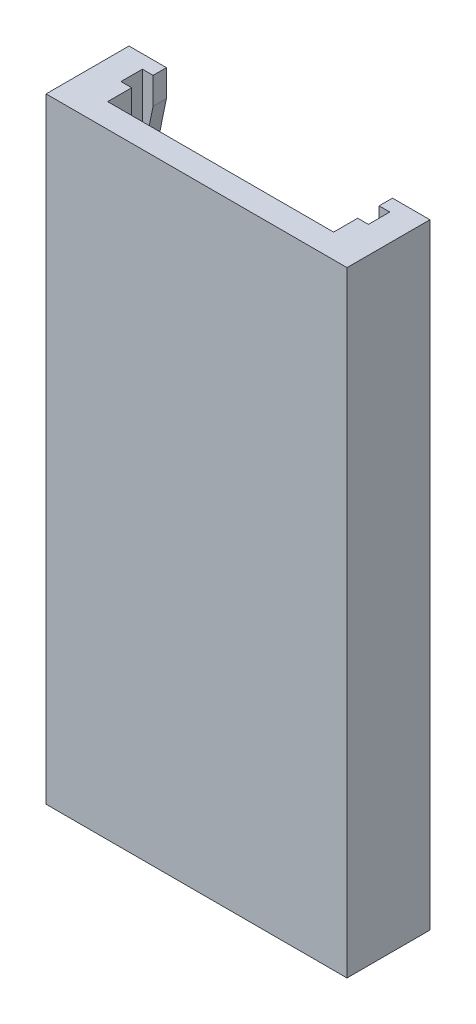
ISO-10303-21;
HEADER;
FILE_DESCRIPTION(('STEP AP214'),'2;1');
FILE_NAME('part.step','',(''),(''),'','','');
FILE_SCHEMA(('AUTOMOTIVE_DESIGN { 1 0 10303 214 1 1 1 1 }'));
ENDSEC;
DATA;
#1=APPLICATION_CONTEXT('core data for automotive mechanical design processes');
#2=APPLICATION_PROTOCOL_DEFINITION('international standard','automotive_design',2000,#1);
#3=PRODUCT_CONTEXT('',#1,'mechanical');
#4=PRODUCT('Part','Part','',(#3));
#5=PRODUCT_RELATED_PRODUCT_CATEGORY('part','',(#4));
#6=PRODUCT_DEFINITION_FORMATION('','',#4);
#7=PRODUCT_DEFINITION_CONTEXT('part definition',#1,'design');
#8=PRODUCT_DEFINITION('design','',#6,#7);
#9=PRODUCT_DEFINITION_SHAPE('','',#8);
#10=(LENGTH_UNIT() NAMED_UNIT(*) SI_UNIT(.MILLI.,.METRE.));
#11=(NAMED_UNIT(*) PLANE_ANGLE_UNIT() SI_UNIT($,.RADIAN.));
#12=(NAMED_UNIT(*) SI_UNIT($,.STERADIAN.) SOLID_ANGLE_UNIT());
#13=UNCERTAINTY_MEASURE_WITH_UNIT(LENGTH_MEASURE(1.E-05),#10,'distance_accuracy_value','');
#14=(GEOMETRIC_REPRESENTATION_CONTEXT(3) GLOBAL_UNCERTAINTY_ASSIGNED_CONTEXT((#13)) GLOBAL_UNIT_ASSIGNED_CONTEXT((#10,
#11,#12)) REPRESENTATION_CONTEXT('',''));
#15=CARTESIAN_POINT('',(0.,0.,0.));
#16=DIRECTION('',(0.,0.,1.));
#17=DIRECTION('',(1.,0.,0.));
#18=AXIS2_PLACEMENT_3D('',#15,#16,#17);
#19=CARTESIAN_POINT('',(0.,-28.9746696035242,0.));
#20=DIRECTION('',(0.,1.,0.));
#21=DIRECTION('',(0.,0.,1.));
#22=AXIS2_PLACEMENT_3D('',#19,#20,#21);
#23=PLANE('',#22);
#24=DIRECTION('',(-1.,0.,0.));
#25=VECTOR('',#24,1.);
#26=CARTESIAN_POINT('',(0.,-28.9746696035242,0.));
#27=LINE('',#26,#25);
#28=CARTESIAN_POINT('',(-0.3281938325991,-28.9746696035242,0.));
#29=VERTEX_POINT('',#28);
#30=CARTESIAN_POINT('',(-15.8281938325991,-28.9746696035242,0.));
#31=VERTEX_POINT('',#30);
#32=EDGE_CURVE('E208',#29,#31,#27,.T.);
#33=ORIENTED_EDGE('',*,*,#32,.T.);
#34=DIRECTION('',(0.,0.,-1.));
#35=VECTOR('',#34,1.);
#36=CARTESIAN_POINT('',(-15.8281938325991,-28.9746696035242,1.));
#37=LINE('',#36,#35);
#38=CARTESIAN_POINT('',(-15.8281938325991,-28.9746696035242,1.));
#39=VERTEX_POINT('',#38);
#40=EDGE_CURVE('E214',#39,#31,#37,.T.);
#41=ORIENTED_EDGE('',*,*,#40,.F.);
#42=DIRECTION('',(1.,0.,0.));
#43=VECTOR('',#42,1.);
#44=CARTESIAN_POINT('',(0.,-28.9746696035242,1.));
#45=LINE('',#44,#43);
#46=CARTESIAN_POINT('',(-17.3281938325991,-28.9746696035242,1.));
#47=VERTEX_POINT('',#46);
#48=EDGE_CURVE('E198',#47,#39,#45,.T.);
#49=ORIENTED_EDGE('',*,*,#48,.F.);
#50=DIRECTION('',(0.,0.,-1.));
#51=VECTOR('',#50,1.);
#52=CARTESIAN_POINT('',(-17.3281938325991,-28.9746696035242,0.));
#53=LINE('',#52,#51);
#54=CARTESIAN_POINT('',(-17.3281938325991,-28.9746696035242,2.6));
#55=VERTEX_POINT('',#54);
#56=EDGE_CURVE('E207',#55,#47,#53,.T.);
#57=ORIENTED_EDGE('',*,*,#56,.F.);
#58=DIRECTION('',(1.,0.,0.));
#59=VECTOR('',#58,1.);
#60=CARTESIAN_POINT('',(0.,-28.9746696035242,2.6));
#61=LINE('',#60,#59);
#62=CARTESIAN_POINT('',(-16.5281938325991,-28.9746696035242,2.6));
#63=VERTEX_POINT('',#62);
#64=EDGE_CURVE('E277',#55,#63,#61,.T.);
#65=ORIENTED_EDGE('',*,*,#64,.T.);
#66=DIRECTION('',(0.,0.,1.));
#67=VECTOR('',#66,1.);
#68=CARTESIAN_POINT('',(-16.5281938325991,-28.9746696035242,0.));
#69=LINE('',#68,#67);
#70=CARTESIAN_POINT('',(-16.5281938325991,-28.9746696035242,4.4));
#71=VERTEX_POINT('',#70);
#72=EDGE_CURVE('E281',#63,#71,#69,.T.);
#73=ORIENTED_EDGE('',*,*,#72,.T.);
#74=DIRECTION('',(1.,0.,0.));
#75=VECTOR('',#74,1.);
#76=CARTESIAN_POINT('',(0.,-28.9746696035242,4.4));
#77=LINE('',#76,#75);
#78=CARTESIAN_POINT('',(0.371806167400894,-28.9746696035242,4.4));
#79=VERTEX_POINT('',#78);
#80=EDGE_CURVE('E285',#71,#79,#77,.T.);
#81=ORIENTED_EDGE('',*,*,#80,.T.);
#82=DIRECTION('',(0.,0.,-1.));
#83=VECTOR('',#82,1.);
#84=CARTESIAN_POINT('',(0.371806167400894,-28.9746696035242,0.));
#85=LINE('',#84,#83);
#86=CARTESIAN_POINT('',(0.371806167400894,-28.9746696035242,2.6));
#87=VERTEX_POINT('',#86);
#88=EDGE_CURVE('E289',#79,#87,#85,.T.);
#89=ORIENTED_EDGE('',*,*,#88,.T.);
#90=DIRECTION('',(1.,0.,0.));
#91=VECTOR('',#90,1.);
#92=CARTESIAN_POINT('',(0.,-28.9746696035242,2.6));
#93=LINE('',#92,#91);
#94=CARTESIAN_POINT('',(1.17180616740089,-28.9746696035242,2.6));
#95=VERTEX_POINT('',#94);
#96=EDGE_CURVE('E293',#87,#95,#93,.T.);
#97=ORIENTED_EDGE('',*,*,#96,.T.);
#98=DIRECTION('',(0.,0.,-1.));
#99=VECTOR('',#98,1.);
#100=CARTESIAN_POINT('',(1.17180616740089,-28.9746696035242,0.));
#101=LINE('',#100,#99);
#102=CARTESIAN_POINT('',(1.17180616740089,-28.9746696035242,1.));
#103=VERTEX_POINT('',#102);
#104=EDGE_CURVE('E297',#95,#103,#101,.T.);
#105=ORIENTED_EDGE('',*,*,#104,.T.);
#106=DIRECTION('',(-1.,0.,0.));
#107=VECTOR('',#106,1.);
#108=CARTESIAN_POINT('',(0.,-28.9746696035242,1.));
#109=LINE('',#108,#107);
#110=CARTESIAN_POINT('',(-0.3281938325991,-28.9746696035242,1.));
#111=VERTEX_POINT('',#110);
#112=EDGE_CURVE('E61',#103,#111,#109,.T.);
#113=ORIENTED_EDGE('',*,*,#112,.T.);
#114=DIRECTION('',(0.,0.,-1.));
#115=VECTOR('',#114,1.);
#116=CARTESIAN_POINT('',(-0.3281938325991,-28.9746696035242,1.));
#117=LINE('',#116,#115);
#118=EDGE_CURVE('E223',#111,#29,#117,.T.);
#119=ORIENTED_EDGE('',*,*,#118,.T.);
#120=EDGE_LOOP('',(#33,#41,#49,#57,#65,#73,#81,#89,#97,#105,#113,#119));
#121=FACE_BOUND('',#120,.T.);
#122=ADVANCED_FACE('F45',(#121),#23,.T.);
#123=CARTESIAN_POINT('',(0.,-28.9746696035242,1.));
#124=DIRECTION('',(0.,0.,-1.));
#125=DIRECTION('',(-1.,0.,0.));
#126=AXIS2_PLACEMENT_3D('',#123,#124,#125);
#127=PLANE('',#126);
#128=DIRECTION('',(0.,1.,0.));
#129=VECTOR('',#128,1.);
#130=CARTESIAN_POINT('',(0.371806167400894,-28.9746696035242,1.));
#131=LINE('',#130,#129);
#132=CARTESIAN_POINT('',(0.371806167400894,12.0253303964758,1.));
#133=VERTEX_POINT('',#132);
#134=CARTESIAN_POINT('',(0.371806167400894,14.0253303964758,1.));
#135=VERTEX_POINT('',#134);
#136=EDGE_CURVE('E300',#133,#135,#131,.T.);
#137=ORIENTED_EDGE('',*,*,#136,.F.);
#138=DIRECTION('',(0.200944143721333,-0.97960270064149,0.));
#139=VECTOR('',#138,1.);
#140=CARTESIAN_POINT('',(8.42745563445858,-27.2459607554302,1.));
#141=LINE('',#140,#139);
#142=CARTESIAN_POINT('',(1.1718061674009,8.12533039647577,1.));
#143=VERTEX_POINT('',#142);
#144=EDGE_CURVE('E263',#133,#143,#141,.T.);
#145=ORIENTED_EDGE('',*,*,#144,.T.);
#146=DIRECTION('',(0.,1.,0.));
#147=VECTOR('',#146,1.);
#148=CARTESIAN_POINT('',(1.17180616740089,-28.9746696035242,1.));
#149=LINE('',#148,#147);
#150=CARTESIAN_POINT('',(1.17180616740089,14.0253303964758,1.));
#151=VERTEX_POINT('',#150);
#152=EDGE_CURVE('E348',#143,#151,#149,.T.);
#153=ORIENTED_EDGE('',*,*,#152,.T.);
#154=DIRECTION('',(-1.,0.,0.));
#155=VECTOR('',#154,1.);
#156=CARTESIAN_POINT('',(0.,14.0253303964758,1.));
#157=LINE('',#156,#155);
#158=EDGE_CURVE('E218',#151,#135,#157,.T.);
#159=ORIENTED_EDGE('',*,*,#158,.T.);
#160=EDGE_LOOP('',(#137,#145,#153,#159));
#161=FACE_BOUND('',#160,.T.);
#162=ADVANCED_FACE('F432',(#161),#127,.F.);
#163=CARTESIAN_POINT('',(0.,-28.9746696035242,1.));
#164=DIRECTION('',(0.,0.,1.));
#165=DIRECTION('',(1.,0.,0.));
#166=AXIS2_PLACEMENT_3D('',#163,#164,#165);
#167=PLANE('',#166);
#168=DIRECTION('',(0.,1.,0.));
#169=VECTOR('',#168,1.);
#170=CARTESIAN_POINT('',(-17.3281938325991,-28.9746696035242,1.));
#171=LINE('',#170,#169);
#172=CARTESIAN_POINT('',(-17.3281938325991,8.12533039647577,1.));
#173=VERTEX_POINT('',#172);
#174=CARTESIAN_POINT('',(-17.3281938325991,14.0253303964758,1.));
#175=VERTEX_POINT('',#174);
#176=EDGE_CURVE('E369',#173,#175,#171,.T.);
#177=ORIENTED_EDGE('',*,*,#176,.F.);
#178=DIRECTION('',(0.200944143721332,0.97960270064149,0.));
#179=VECTOR('',#178,1.);
#180=CARTESIAN_POINT('',(-23.9314718103364,-24.0656497449937,1.));
#181=LINE('',#180,#179);
#182=CARTESIAN_POINT('',(-16.5281938325991,12.0253303964758,1.));
#183=VERTEX_POINT('',#182);
#184=EDGE_CURVE('E219',#173,#183,#181,.T.);
#185=ORIENTED_EDGE('',*,*,#184,.T.);
#186=DIRECTION('',(0.,1.,0.));
#187=VECTOR('',#186,1.);
#188=CARTESIAN_POINT('',(-16.5281938325991,-28.9746696035242,1.));
#189=LINE('',#188,#187);
#190=CARTESIAN_POINT('',(-16.5281938325991,14.0253303964758,1.));
#191=VERTEX_POINT('',#190);
#192=EDGE_CURVE('E370',#183,#191,#189,.T.);
#193=ORIENTED_EDGE('',*,*,#192,.T.);
#194=DIRECTION('',(1.,0.,0.));
#195=VECTOR('',#194,1.);
#196=CARTESIAN_POINT('',(0.,14.0253303964758,1.));
#197=LINE('',#196,#195);
#198=EDGE_CURVE('E312',#175,#191,#197,.T.);
#199=ORIENTED_EDGE('',*,*,#198,.F.);
#200=EDGE_LOOP('',(#177,#185,#193,#199));
#201=FACE_BOUND('',#200,.T.);
#202=ADVANCED_FACE('F460',(#201),#167,.T.);
#203=CARTESIAN_POINT('',(-16.5281938325991,-28.9746696035242,0.));
#204=DIRECTION('',(1.,0.,0.));
#205=DIRECTION('',(0.,0.,-1.));
#206=AXIS2_PLACEMENT_3D('',#203,#204,#205);
#207=PLANE('',#206);
#208=ORIENTED_EDGE('',*,*,#192,.F.);
#209=DIRECTION('',(0.,0.,-1.));
#210=VECTOR('',#209,1.);
#211=CARTESIAN_POINT('',(-16.5281938325991,12.0253303964758,6.36112017807918E-13));
#212=LINE('',#211,#210);
#213=CARTESIAN_POINT('',(-16.5281938325991,12.0253303964758,0.));
#214=VERTEX_POINT('',#213);
#215=EDGE_CURVE('E11',#183,#214,#212,.T.);
#216=ORIENTED_EDGE('',*,*,#215,.T.);
#217=DIRECTION('',(0.,1.,0.));
#218=VECTOR('',#217,1.);
#219=CARTESIAN_POINT('',(-16.5281938325991,-28.9746696035242,0.));
#220=LINE('',#219,#218);
#221=CARTESIAN_POINT('',(-16.5281938325991,14.0253303964758,0.));
#222=VERTEX_POINT('',#221);
#223=EDGE_CURVE('E373',#214,#222,#220,.T.);
#224=ORIENTED_EDGE('',*,*,#223,.T.);
#225=DIRECTION('',(0.,0.,-1.));
#226=VECTOR('',#225,1.);
#227=CARTESIAN_POINT('',(-16.5281938325991,14.0253303964758,0.));
#228=LINE('',#227,#226);
#229=EDGE_CURVE('E308',#191,#222,#228,.T.);
#230=ORIENTED_EDGE('',*,*,#229,.F.);
#231=EDGE_LOOP('',(#208,#216,#224,#230));
#232=FACE_BOUND('',#231,.T.);
#233=ADVANCED_FACE('F490',(#232),#207,.T.);
#234=CARTESIAN_POINT('',(0.371806167400894,-28.9746696035242,0.));
#235=DIRECTION('',(1.,0.,0.));
#236=DIRECTION('',(0.,0.,-1.));
#237=AXIS2_PLACEMENT_3D('',#234,#235,#236);
#238=PLANE('',#237);
#239=DIRECTION('',(0.,1.,0.));
#240=VECTOR('',#239,1.);
#241=CARTESIAN_POINT('',(0.371806167400894,-28.9746696035242,0.));
#242=LINE('',#241,#240);
#243=CARTESIAN_POINT('',(0.371806167400894,12.0253303964758,0.));
#244=VERTEX_POINT('',#243);
#245=CARTESIAN_POINT('',(0.371806167400894,14.0253303964758,0.));
#246=VERTEX_POINT('',#245);
#247=EDGE_CURVE('E376',#244,#246,#242,.T.);
#248=ORIENTED_EDGE('',*,*,#247,.F.);
#249=DIRECTION('',(0.,0.,1.));
#250=VECTOR('',#249,1.);
#251=CARTESIAN_POINT('',(0.371806167400894,12.0253303964758,0.));
#252=LINE('',#251,#250);
#253=EDGE_CURVE('E54',#244,#133,#252,.T.);
#254=ORIENTED_EDGE('',*,*,#253,.T.);
#255=ORIENTED_EDGE('',*,*,#136,.T.);
#256=DIRECTION('',(0.,0.,-1.));
#257=VECTOR('',#256,1.);
#258=CARTESIAN_POINT('',(0.371806167400894,14.0253303964758,0.));
#259=LINE('',#258,#257);
#260=EDGE_CURVE('E304',#135,#246,#259,.T.);
#261=ORIENTED_EDGE('',*,*,#260,.T.);
#262=EDGE_LOOP('',(#248,#254,#255,#261));
#263=FACE_BOUND('',#262,.T.);
#264=ADVANCED_FACE('F428',(#263),#238,.F.);
#265=CARTESIAN_POINT('',(-19.3281938325991,14.0253303964758,6.2));
#266=DIRECTION('',(0.,-1.,0.));
#267=DIRECTION('',(0.,0.,-1.));
#268=AXIS2_PLACEMENT_3D('',#265,#266,#267);
#269=PLANE('',#268);
#270=ORIENTED_EDGE('',*,*,#229,.T.);
#271=DIRECTION('',(-1.,0.,0.));
#272=VECTOR('',#271,1.);
#273=CARTESIAN_POINT('',(-19.3281938325991,14.0253303964758,0.));
#274=LINE('',#273,#272);
#275=CARTESIAN_POINT('',(-19.3281938325991,14.0253303964758,0.));
#276=VERTEX_POINT('',#275);
#277=EDGE_CURVE('E405',#222,#276,#274,.T.);
#278=ORIENTED_EDGE('',*,*,#277,.T.);
#279=DIRECTION('',(0.,0.,-1.));
#280=VECTOR('',#279,1.);
#281=CARTESIAN_POINT('',(-19.3281938325991,14.0253303964758,6.2));
#282=LINE('',#281,#280);
#283=CARTESIAN_POINT('',(-19.3281938325991,14.0253303964758,6.2));
#284=VERTEX_POINT('',#283);
#285=EDGE_CURVE('E395',#284,#276,#282,.T.);
#286=ORIENTED_EDGE('',*,*,#285,.F.);
#287=DIRECTION('',(-1.,0.,0.));
#288=VECTOR('',#287,1.);
#289=CARTESIAN_POINT('',(-19.3281938325991,14.0253303964758,6.2));
#290=LINE('',#289,#288);
#291=CARTESIAN_POINT('',(3.17180616740089,14.0253303964758,6.2));
#292=VERTEX_POINT('',#291);
#293=EDGE_CURVE('E392',#292,#284,#290,.T.);
#294=ORIENTED_EDGE('',*,*,#293,.F.);
#295=DIRECTION('',(0.,0.,-1.));
#296=VECTOR('',#295,1.);
#297=CARTESIAN_POINT('',(3.17180616740089,14.0253303964758,6.2));
#298=LINE('',#297,#296);
#299=CARTESIAN_POINT('',(3.17180616740089,14.0253303964758,0.));
#300=VERTEX_POINT('',#299);
#301=EDGE_CURVE('E412',#292,#300,#298,.T.);
#302=ORIENTED_EDGE('',*,*,#301,.T.);
#303=EDGE_CURVE('E386',#300,#246,#274,.T.);
#304=ORIENTED_EDGE('',*,*,#303,.T.);
#305=ORIENTED_EDGE('',*,*,#260,.F.);
#306=ORIENTED_EDGE('',*,*,#158,.F.);
#307=DIRECTION('',(0.,0.,-1.));
#308=VECTOR('',#307,1.);
#309=CARTESIAN_POINT('',(1.17180616740089,14.0253303964758,0.));
#310=LINE('',#309,#308);
#311=CARTESIAN_POINT('',(1.17180616740089,14.0253303964758,2.6));
#312=VERTEX_POINT('',#311);
#313=EDGE_CURVE('E272',#312,#151,#310,.T.);
#314=ORIENTED_EDGE('',*,*,#313,.F.);
#315=DIRECTION('',(1.,0.,0.));
#316=VECTOR('',#315,1.);
#317=CARTESIAN_POINT('',(0.,14.0253303964758,2.6));
#318=LINE('',#317,#316);
#319=CARTESIAN_POINT('',(0.371806167400894,14.0253303964758,2.6));
#320=VERTEX_POINT('',#319);
#321=EDGE_CURVE('E336',#320,#312,#318,.T.);
#322=ORIENTED_EDGE('',*,*,#321,.F.);
#323=DIRECTION('',(0.,0.,-1.));
#324=VECTOR('',#323,1.);
#325=CARTESIAN_POINT('',(0.371806167400894,14.0253303964758,0.));
#326=LINE('',#325,#324);
#327=CARTESIAN_POINT('',(0.371806167400894,14.0253303964758,4.4));
#328=VERTEX_POINT('',#327);
#329=EDGE_CURVE('E332',#328,#320,#326,.T.);
#330=ORIENTED_EDGE('',*,*,#329,.F.);
#331=DIRECTION('',(1.,0.,0.));
#332=VECTOR('',#331,1.);
#333=CARTESIAN_POINT('',(0.,14.0253303964758,4.4));
#334=LINE('',#333,#332);
#335=CARTESIAN_POINT('',(-16.5281938325991,14.0253303964758,4.4));
#336=VERTEX_POINT('',#335);
#337=EDGE_CURVE('E328',#336,#328,#334,.T.);
#338=ORIENTED_EDGE('',*,*,#337,.F.);
#339=DIRECTION('',(0.,0.,1.));
#340=VECTOR('',#339,1.);
#341=CARTESIAN_POINT('',(-16.5281938325991,14.0253303964758,0.));
#342=LINE('',#341,#340);
#343=CARTESIAN_POINT('',(-16.5281938325991,14.0253303964758,2.6));
#344=VERTEX_POINT('',#343);
#345=EDGE_CURVE('E324',#344,#336,#342,.T.);
#346=ORIENTED_EDGE('',*,*,#345,.F.);
#347=DIRECTION('',(1.,0.,0.));
#348=VECTOR('',#347,1.);
#349=CARTESIAN_POINT('',(0.,14.0253303964758,2.6));
#350=LINE('',#349,#348);
#351=CARTESIAN_POINT('',(-17.3281938325991,14.0253303964758,2.6));
#352=VERTEX_POINT('',#351);
#353=EDGE_CURVE('E320',#352,#344,#350,.T.);
#354=ORIENTED_EDGE('',*,*,#353,.F.);
#355=DIRECTION('',(0.,0.,-1.));
#356=VECTOR('',#355,1.);
#357=CARTESIAN_POINT('',(-17.3281938325991,14.0253303964758,0.));
#358=LINE('',#357,#356);
#359=EDGE_CURVE('E316',#352,#175,#358,.T.);
#360=ORIENTED_EDGE('',*,*,#359,.T.);
#361=ORIENTED_EDGE('',*,*,#198,.T.);
#362=EDGE_LOOP('',(#270,#278,#286,#294,#302,#304,#305,#306,#314,#322,#330,#338,#346,#354,#360,#361));
#363=FACE_BOUND('',#362,.T.);
#364=ADVANCED_FACE('F438',(#363),#269,.F.);
#365=CARTESIAN_POINT('',(0.,0.,0.));
#366=DIRECTION('',(0.,0.,1.));
#367=DIRECTION('',(1.,0.,0.));
#368=AXIS2_PLACEMENT_3D('',#365,#366,#367);
#369=PLANE('',#368);
#370=ORIENTED_EDGE('',*,*,#32,.F.);
#371=DIRECTION('',(-0.55519061156244,-0.831723141936621,0.));
#372=VECTOR('',#371,1.);
#373=CARTESIAN_POINT('',(13.1524523508458,-8.77950569850609,0.));
#374=LINE('',#373,#372);
#375=CARTESIAN_POINT('',(1.1718061674009,-26.7275409833303,0.));
#376=VERTEX_POINT('',#375);
#377=EDGE_CURVE('E69',#376,#29,#374,.T.);
#378=ORIENTED_EDGE('',*,*,#377,.F.);
#379=DIRECTION('',(0.,-1.,0.));
#380=VECTOR('',#379,1.);
#381=CARTESIAN_POINT('',(1.1718061674009,0.,0.));
#382=LINE('',#381,#380);
#383=CARTESIAN_POINT('',(1.1718061674009,8.12533039647577,0.));
#384=VERTEX_POINT('',#383);
#385=EDGE_CURVE('E233',#384,#376,#382,.T.);
#386=ORIENTED_EDGE('',*,*,#385,.F.);
#387=DIRECTION('',(0.200944143721333,-0.97960270064149,0.));
#388=VECTOR('',#387,1.);
#389=CARTESIAN_POINT('',(2.72392445698247,0.55875373476564,0.));
#390=LINE('',#389,#388);
#391=EDGE_CURVE('E229',#244,#384,#390,.T.);
#392=ORIENTED_EDGE('',*,*,#391,.F.);
#393=ORIENTED_EDGE('',*,*,#247,.T.);
#394=ORIENTED_EDGE('',*,*,#303,.F.);
#395=DIRECTION('',(0.,1.,0.));
#396=VECTOR('',#395,1.);
#397=CARTESIAN_POINT('',(3.17180616740089,14.0253303964758,0.));
#398=LINE('',#397,#396);
#399=CARTESIAN_POINT('',(3.1718061674009,-31.9746696035242,0.));
#400=VERTEX_POINT('',#399);
#401=EDGE_CURVE('E402',#400,#300,#398,.T.);
#402=ORIENTED_EDGE('',*,*,#401,.F.);
#403=DIRECTION('',(1.,0.,0.));
#404=VECTOR('',#403,1.);
#405=CARTESIAN_POINT('',(-19.3281938325991,-31.9746696035242,0.));
#406=LINE('',#405,#404);
#407=CARTESIAN_POINT('',(-19.3281938325991,-31.9746696035242,0.));
#408=VERTEX_POINT('',#407);
#409=EDGE_CURVE('E399',#408,#400,#406,.T.);
#410=ORIENTED_EDGE('',*,*,#409,.F.);
#411=DIRECTION('',(0.,-1.,0.));
#412=VECTOR('',#411,1.);
#413=CARTESIAN_POINT('',(-19.3281938325991,14.0253303964758,0.));
#414=LINE('',#413,#412);
#415=EDGE_CURVE('E347',#276,#408,#414,.T.);
#416=ORIENTED_EDGE('',*,*,#415,.F.);
#417=ORIENTED_EDGE('',*,*,#277,.F.);
#418=ORIENTED_EDGE('',*,*,#223,.F.);
#419=DIRECTION('',(-0.200944143721332,-0.97960270064149,0.));
#420=VECTOR('',#419,1.);
#421=CARTESIAN_POINT('',(-18.2279406328604,3.73906474520214,0.));
#422=LINE('',#421,#420);
#423=CARTESIAN_POINT('',(-17.3281938325991,8.12533039647577,0.));
#424=VERTEX_POINT('',#423);
#425=EDGE_CURVE('E253',#214,#424,#422,.T.);
#426=ORIENTED_EDGE('',*,*,#425,.T.);
#427=DIRECTION('',(0.,1.,0.));
#428=VECTOR('',#427,1.);
#429=CARTESIAN_POINT('',(-17.3281938325991,0.,0.));
#430=LINE('',#429,#428);
#431=CARTESIAN_POINT('',(-17.3281938325991,-26.7275409833303,0.));
#432=VERTEX_POINT('',#431);
#433=EDGE_CURVE('E249',#432,#424,#430,.T.);
#434=ORIENTED_EDGE('',*,*,#433,.F.);
#435=DIRECTION('',(-0.555190611562439,0.831723141936622,0.));
#436=VECTOR('',#435,1.);
#437=CARTESIAN_POINT('',(-24.3288497687963,-16.2399581070908,0.));
#438=LINE('',#437,#436);
#439=EDGE_CURVE('E226',#31,#432,#438,.T.);
#440=ORIENTED_EDGE('',*,*,#439,.F.);
#441=EDGE_LOOP('',(#370,#378,#386,#392,#393,#394,#402,#410,#416,#417,#418,#426,#434,#440));
#442=FACE_BOUND('',#441,.T.);
#443=ADVANCED_FACE('F444',(#442),#369,.F.);
#444=CARTESIAN_POINT('',(-19.3281938325991,14.0253303964758,6.2));
#445=DIRECTION('',(1.,0.,0.));
#446=DIRECTION('',(0.,1.,0.));
#447=AXIS2_PLACEMENT_3D('',#444,#445,#446);
#448=PLANE('',#447);
#449=ORIENTED_EDGE('',*,*,#415,.T.);
#450=DIRECTION('',(0.,0.,-1.));
#451=VECTOR('',#450,1.);
#452=CARTESIAN_POINT('',(-19.3281938325991,-31.9746696035242,6.2));
#453=LINE('',#452,#451);
#454=CARTESIAN_POINT('',(-19.3281938325991,-31.9746696035242,6.2));
#455=VERTEX_POINT('',#454);
#456=EDGE_CURVE('E420',#455,#408,#453,.T.);
#457=ORIENTED_EDGE('',*,*,#456,.F.);
#458=DIRECTION('',(0.,-1.,0.));
#459=VECTOR('',#458,1.);
#460=CARTESIAN_POINT('',(-19.3281938325991,14.0253303964758,6.2));
#461=LINE('',#460,#459);
#462=EDGE_CURVE('E381',#284,#455,#461,.T.);
#463=ORIENTED_EDGE('',*,*,#462,.F.);
#464=ORIENTED_EDGE('',*,*,#285,.T.);
#465=EDGE_LOOP('',(#449,#457,#463,#464));
#466=FACE_BOUND('',#465,.T.);
#467=ADVANCED_FACE('F47',(#466),#448,.F.);
#468=CARTESIAN_POINT('',(-19.3281938325991,-31.9746696035242,6.2));
#469=DIRECTION('',(0.,1.,0.));
#470=DIRECTION('',(0.,0.,1.));
#471=AXIS2_PLACEMENT_3D('',#468,#469,#470);
#472=PLANE('',#471);
#473=ORIENTED_EDGE('',*,*,#409,.T.);
#474=DIRECTION('',(0.,0.,-1.));
#475=VECTOR('',#474,1.);
#476=CARTESIAN_POINT('',(3.1718061674009,-31.9746696035242,6.2));
#477=LINE('',#476,#475);
#478=CARTESIAN_POINT('',(3.1718061674009,-31.9746696035242,6.2));
#479=VERTEX_POINT('',#478);
#480=EDGE_CURVE('E416',#479,#400,#477,.T.);
#481=ORIENTED_EDGE('',*,*,#480,.F.);
#482=DIRECTION('',(1.,0.,0.));
#483=VECTOR('',#482,1.);
#484=CARTESIAN_POINT('',(-19.3281938325991,-31.9746696035242,6.2));
#485=LINE('',#484,#483);
#486=EDGE_CURVE('E385',#455,#479,#485,.T.);
#487=ORIENTED_EDGE('',*,*,#486,.F.);
#488=ORIENTED_EDGE('',*,*,#456,.T.);
#489=EDGE_LOOP('',(#473,#481,#487,#488));
#490=FACE_BOUND('',#489,.T.);
#491=ADVANCED_FACE('F504',(#490),#472,.F.);
#492=CARTESIAN_POINT('',(3.17180616740089,14.0253303964758,6.2));
#493=DIRECTION('',(-1.,0.,0.));
#494=DIRECTION('',(0.,-1.,0.));
#495=AXIS2_PLACEMENT_3D('',#492,#493,#494);
#496=PLANE('',#495);
#497=ORIENTED_EDGE('',*,*,#401,.T.);
#498=ORIENTED_EDGE('',*,*,#301,.F.);
#499=DIRECTION('',(0.,1.,0.));
#500=VECTOR('',#499,1.);
#501=CARTESIAN_POINT('',(3.17180616740089,14.0253303964758,6.2));
#502=LINE('',#501,#500);
#503=EDGE_CURVE('E389',#479,#292,#502,.T.);
#504=ORIENTED_EDGE('',*,*,#503,.F.);
#505=ORIENTED_EDGE('',*,*,#480,.T.);
#506=EDGE_LOOP('',(#497,#498,#504,#505));
#507=FACE_BOUND('',#506,.T.);
#508=ADVANCED_FACE('F502',(#507),#496,.F.);
#509=CARTESIAN_POINT('',(0.,0.,6.2));
#510=DIRECTION('',(0.,0.,1.));
#511=DIRECTION('',(1.,0.,0.));
#512=AXIS2_PLACEMENT_3D('',#509,#510,#511);
#513=PLANE('',#512);
#514=ORIENTED_EDGE('',*,*,#462,.T.);
#515=ORIENTED_EDGE('',*,*,#486,.T.);
#516=ORIENTED_EDGE('',*,*,#503,.T.);
#517=ORIENTED_EDGE('',*,*,#293,.T.);
#518=EDGE_LOOP('',(#514,#515,#516,#517));
#519=FACE_BOUND('',#518,.T.);
#520=ADVANCED_FACE('F498',(#519),#513,.T.);
#521=CARTESIAN_POINT('',(1.1718061674009,-26.7275409833303,1.));
#522=VERTEX_POINT('',#521);
#523=EDGE_CURVE('E343',#103,#522,#149,.T.);
#524=ORIENTED_EDGE('',*,*,#523,.T.);
#525=DIRECTION('',(-0.55519061156244,-0.831723141936621,0.));
#526=VECTOR('',#525,1.);
#527=CARTESIAN_POINT('',(-0.227032476520046,-28.8231212178556,1.));
#528=LINE('',#527,#526);
#529=EDGE_CURVE('E244',#522,#111,#528,.T.);
#530=ORIENTED_EDGE('',*,*,#529,.T.);
#531=ORIENTED_EDGE('',*,*,#112,.F.);
#532=EDGE_LOOP('',(#524,#530,#531));
#533=FACE_BOUND('',#532,.T.);
#534=ADVANCED_FACE('F482',(#533),#127,.F.);
#535=CARTESIAN_POINT('',(1.17180616740089,-28.9746696035242,0.));
#536=DIRECTION('',(1.,0.,0.));
#537=DIRECTION('',(0.,0.,-1.));
#538=AXIS2_PLACEMENT_3D('',#535,#536,#537);
#539=PLANE('',#538);
#540=ORIENTED_EDGE('',*,*,#152,.F.);
#541=DIRECTION('',(0.,0.,-1.));
#542=VECTOR('',#541,1.);
#543=CARTESIAN_POINT('',(1.1718061674009,8.12533039647577,1.1));
#544=LINE('',#543,#542);
#545=EDGE_CURVE('E240',#143,#384,#544,.T.);
#546=ORIENTED_EDGE('',*,*,#545,.T.);
#547=ORIENTED_EDGE('',*,*,#385,.T.);
#548=DIRECTION('',(0.,0.,-1.));
#549=VECTOR('',#548,1.);
#550=CARTESIAN_POINT('',(1.1718061674009,-26.7275409833303,1.1));
#551=LINE('',#550,#549);
#552=EDGE_CURVE('E241',#522,#376,#551,.T.);
#553=ORIENTED_EDGE('',*,*,#552,.F.);
#554=ORIENTED_EDGE('',*,*,#523,.F.);
#555=ORIENTED_EDGE('',*,*,#104,.F.);
#556=DIRECTION('',(0.,1.,0.));
#557=VECTOR('',#556,1.);
#558=CARTESIAN_POINT('',(1.17180616740089,-28.9746696035242,2.6));
#559=LINE('',#558,#557);
#560=EDGE_CURVE('E349',#95,#312,#559,.T.);
#561=ORIENTED_EDGE('',*,*,#560,.T.);
#562=ORIENTED_EDGE('',*,*,#313,.T.);
#563=EDGE_LOOP('',(#540,#546,#547,#553,#554,#555,#561,#562));
#564=FACE_BOUND('',#563,.T.);
#565=ADVANCED_FACE('F448',(#564),#539,.F.);
#566=CARTESIAN_POINT('',(0.,-28.9746696035242,2.6));
#567=DIRECTION('',(0.,0.,1.));
#568=DIRECTION('',(1.,0.,0.));
#569=AXIS2_PLACEMENT_3D('',#566,#567,#568);
#570=PLANE('',#569);
#571=ORIENTED_EDGE('',*,*,#321,.T.);
#572=ORIENTED_EDGE('',*,*,#560,.F.);
#573=ORIENTED_EDGE('',*,*,#96,.F.);
#574=DIRECTION('',(0.,1.,0.));
#575=VECTOR('',#574,1.);
#576=CARTESIAN_POINT('',(0.371806167400894,-28.9746696035242,2.6));
#577=LINE('',#576,#575);
#578=EDGE_CURVE('E352',#87,#320,#577,.T.);
#579=ORIENTED_EDGE('',*,*,#578,.T.);
#580=EDGE_LOOP('',(#571,#572,#573,#579));
#581=FACE_BOUND('',#580,.T.);
#582=ADVANCED_FACE('F522',(#581),#570,.F.);
#583=CARTESIAN_POINT('',(0.371806167400894,-28.9746696035242,0.));
#584=DIRECTION('',(1.,0.,0.));
#585=DIRECTION('',(0.,0.,-1.));
#586=AXIS2_PLACEMENT_3D('',#583,#584,#585);
#587=PLANE('',#586);
#588=ORIENTED_EDGE('',*,*,#329,.T.);
#589=ORIENTED_EDGE('',*,*,#578,.F.);
#590=ORIENTED_EDGE('',*,*,#88,.F.);
#591=DIRECTION('',(0.,1.,0.));
#592=VECTOR('',#591,1.);
#593=CARTESIAN_POINT('',(0.371806167400894,-28.9746696035242,4.4));
#594=LINE('',#593,#592);
#595=EDGE_CURVE('E355',#79,#328,#594,.T.);
#596=ORIENTED_EDGE('',*,*,#595,.T.);
#597=EDGE_LOOP('',(#588,#589,#590,#596));
#598=FACE_BOUND('',#597,.T.);
#599=ADVANCED_FACE('F477',(#598),#587,.F.);
#600=CARTESIAN_POINT('',(0.,-28.9746696035242,4.4));
#601=DIRECTION('',(0.,0.,1.));
#602=DIRECTION('',(1.,0.,0.));
#603=AXIS2_PLACEMENT_3D('',#600,#601,#602);
#604=PLANE('',#603);
#605=ORIENTED_EDGE('',*,*,#337,.T.);
#606=ORIENTED_EDGE('',*,*,#595,.F.);
#607=ORIENTED_EDGE('',*,*,#80,.F.);
#608=DIRECTION('',(0.,1.,0.));
#609=VECTOR('',#608,1.);
#610=CARTESIAN_POINT('',(-16.5281938325991,-28.9746696035242,4.4));
#611=LINE('',#610,#609);
#612=EDGE_CURVE('E358',#71,#336,#611,.T.);
#613=ORIENTED_EDGE('',*,*,#612,.T.);
#614=EDGE_LOOP('',(#605,#606,#607,#613));
#615=FACE_BOUND('',#614,.T.);
#616=ADVANCED_FACE('F473',(#615),#604,.F.);
#617=CARTESIAN_POINT('',(-16.5281938325991,-28.9746696035242,0.));
#618=DIRECTION('',(-1.,0.,0.));
#619=DIRECTION('',(0.,0.,1.));
#620=AXIS2_PLACEMENT_3D('',#617,#618,#619);
#621=PLANE('',#620);
#622=ORIENTED_EDGE('',*,*,#345,.T.);
#623=ORIENTED_EDGE('',*,*,#612,.F.);
#624=ORIENTED_EDGE('',*,*,#72,.F.);
#625=DIRECTION('',(0.,1.,0.));
#626=VECTOR('',#625,1.);
#627=CARTESIAN_POINT('',(-16.5281938325991,-28.9746696035242,2.6));
#628=LINE('',#627,#626);
#629=EDGE_CURVE('E361',#63,#344,#628,.T.);
#630=ORIENTED_EDGE('',*,*,#629,.T.);
#631=EDGE_LOOP('',(#622,#623,#624,#630));
#632=FACE_BOUND('',#631,.T.);
#633=ADVANCED_FACE('F471',(#632),#621,.F.);
#634=CARTESIAN_POINT('',(0.,-28.9746696035242,2.6));
#635=DIRECTION('',(0.,0.,1.));
#636=DIRECTION('',(1.,0.,0.));
#637=AXIS2_PLACEMENT_3D('',#634,#635,#636);
#638=PLANE('',#637);
#639=ORIENTED_EDGE('',*,*,#353,.T.);
#640=ORIENTED_EDGE('',*,*,#629,.F.);
#641=ORIENTED_EDGE('',*,*,#64,.F.);
#642=DIRECTION('',(0.,1.,0.));
#643=VECTOR('',#642,1.);
#644=CARTESIAN_POINT('',(-17.3281938325991,-28.9746696035242,2.6));
#645=LINE('',#644,#643);
#646=EDGE_CURVE('E364',#55,#352,#645,.T.);
#647=ORIENTED_EDGE('',*,*,#646,.T.);
#648=EDGE_LOOP('',(#639,#640,#641,#647));
#649=FACE_BOUND('',#648,.T.);
#650=ADVANCED_FACE('F466',(#649),#638,.F.);
#651=CARTESIAN_POINT('',(-17.3281938325991,-28.9746696035242,0.));
#652=DIRECTION('',(1.,0.,0.));
#653=DIRECTION('',(0.,0.,-1.));
#654=AXIS2_PLACEMENT_3D('',#651,#652,#653);
#655=PLANE('',#654);
#656=CARTESIAN_POINT('',(-17.3281938325991,-26.7275409833303,1.));
#657=VERTEX_POINT('',#656);
#658=EDGE_CURVE('E203',#47,#657,#171,.T.);
#659=ORIENTED_EDGE('',*,*,#658,.T.);
#660=DIRECTION('',(0.,0.,-1.));
#661=VECTOR('',#660,1.);
#662=CARTESIAN_POINT('',(-17.3281938325991,-26.7275409833303,1.1));
#663=LINE('',#662,#661);
#664=EDGE_CURVE('E216',#657,#432,#663,.T.);
#665=ORIENTED_EDGE('',*,*,#664,.T.);
#666=ORIENTED_EDGE('',*,*,#433,.T.);
#667=DIRECTION('',(0.,0.,-1.));
#668=VECTOR('',#667,1.);
#669=CARTESIAN_POINT('',(-17.3281938325991,8.12533039647577,1.1));
#670=LINE('',#669,#668);
#671=EDGE_CURVE('E234',#173,#424,#670,.T.);
#672=ORIENTED_EDGE('',*,*,#671,.F.);
#673=ORIENTED_EDGE('',*,*,#176,.T.);
#674=ORIENTED_EDGE('',*,*,#359,.F.);
#675=ORIENTED_EDGE('',*,*,#646,.F.);
#676=ORIENTED_EDGE('',*,*,#56,.T.);
#677=EDGE_LOOP('',(#659,#665,#666,#672,#673,#674,#675,#676));
#678=FACE_BOUND('',#677,.T.);
#679=ADVANCED_FACE('F457',(#678),#655,.T.);
#680=DIRECTION('',(0.555190611562438,-0.831723141936622,0.));
#681=VECTOR('',#680,1.);
#682=CARTESIAN_POINT('',(-10.9493649414304,-36.2835736264404,1.));
#683=LINE('',#682,#681);
#684=EDGE_CURVE('E201',#657,#39,#683,.T.);
#685=ORIENTED_EDGE('',*,*,#684,.F.);
#686=ORIENTED_EDGE('',*,*,#658,.F.);
#687=ORIENTED_EDGE('',*,*,#48,.T.);
#688=EDGE_LOOP('',(#685,#686,#687));
#689=FACE_BOUND('',#688,.T.);
#690=ADVANCED_FACE('F200',(#689),#167,.T.);
#691=CARTESIAN_POINT('',(2.72392445698247,0.55875373476564,1.1));
#692=DIRECTION('',(0.97960270064149,0.200944143721333,0.));
#693=DIRECTION('',(-0.200944143721333,0.97960270064149,0.));
#694=AXIS2_PLACEMENT_3D('',#691,#692,#693);
#695=PLANE('',#694);
#696=ORIENTED_EDGE('',*,*,#253,.F.);
#697=ORIENTED_EDGE('',*,*,#391,.T.);
#698=ORIENTED_EDGE('',*,*,#545,.F.);
#699=ORIENTED_EDGE('',*,*,#144,.F.);
#700=EDGE_LOOP('',(#696,#697,#698,#699));
#701=FACE_BOUND('',#700,.T.);
#702=ADVANCED_FACE('F446',(#701),#695,.F.);
#703=CARTESIAN_POINT('',(13.1524523508458,-8.77950569850609,1.1));
#704=DIRECTION('',(0.831723141936621,-0.55519061156244,0.));
#705=DIRECTION('',(0.55519061156244,0.831723141936621,0.));
#706=AXIS2_PLACEMENT_3D('',#703,#704,#705);
#707=PLANE('',#706);
#708=ORIENTED_EDGE('',*,*,#552,.T.);
#709=ORIENTED_EDGE('',*,*,#377,.T.);
#710=ORIENTED_EDGE('',*,*,#118,.F.);
#711=ORIENTED_EDGE('',*,*,#529,.F.);
#712=EDGE_LOOP('',(#708,#709,#710,#711));
#713=FACE_BOUND('',#712,.T.);
#714=ADVANCED_FACE('F483',(#713),#707,.F.);
#715=CARTESIAN_POINT('',(-24.3288497687963,-16.2399581070908,1.1));
#716=DIRECTION('',(-0.831723141936622,-0.555190611562438,0.));
#717=DIRECTION('',(0.555190611562438,-0.831723141936622,0.));
#718=AXIS2_PLACEMENT_3D('',#715,#716,#717);
#719=PLANE('',#718);
#720=ORIENTED_EDGE('',*,*,#684,.T.);
#721=ORIENTED_EDGE('',*,*,#40,.T.);
#722=ORIENTED_EDGE('',*,*,#439,.T.);
#723=ORIENTED_EDGE('',*,*,#664,.F.);
#724=EDGE_LOOP('',(#720,#721,#722,#723));
#725=FACE_BOUND('',#724,.T.);
#726=ADVANCED_FACE('F212',(#725),#719,.F.);
#727=CARTESIAN_POINT('',(-18.2279406328604,3.73906474520214,1.1));
#728=DIRECTION('',(0.97960270064149,-0.200944143721332,0.));
#729=DIRECTION('',(0.200944143721332,0.97960270064149,0.));
#730=AXIS2_PLACEMENT_3D('',#727,#728,#729);
#731=PLANE('',#730);
#732=ORIENTED_EDGE('',*,*,#671,.T.);
#733=ORIENTED_EDGE('',*,*,#425,.F.);
#734=ORIENTED_EDGE('',*,*,#215,.F.);
#735=ORIENTED_EDGE('',*,*,#184,.F.);
#736=EDGE_LOOP('',(#732,#733,#734,#735));
#737=FACE_BOUND('',#736,.T.);
#738=ADVANCED_FACE('F488',(#737),#731,.T.);
#739=CLOSED_SHELL('',(#122,#162,#202,#233,#264,#364,#443,#467,#491,#508,#520,#534,#565,#582,
#599,#616,#633,#650,#679,#690,#702,#714,#726,#738));
#740=MANIFOLD_SOLID_BREP('B2',#739);
#741=ADVANCED_BREP_SHAPE_REPRESENTATION('',(#18,#740),#14);
#742=SHAPE_DEFINITION_REPRESENTATION(#9,#741);
ENDSEC;
END-ISO-10303-21;
